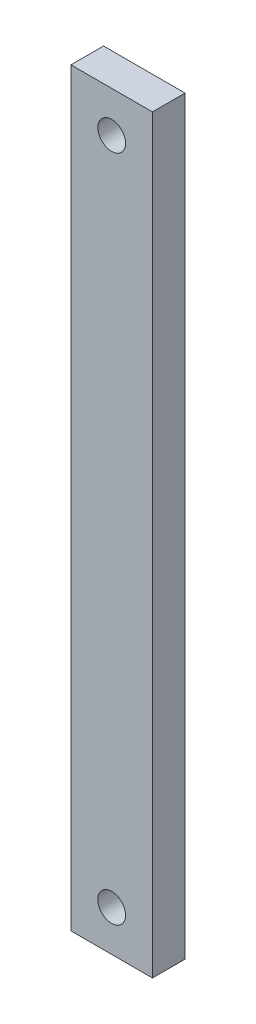
ISO-10303-21;
HEADER;
FILE_DESCRIPTION(('STEP AP214'),'2;1');
FILE_NAME('part.step','',(''),(''),'','','');
FILE_SCHEMA(('AUTOMOTIVE_DESIGN { 1 0 10303 214 1 1 1 1 }'));
ENDSEC;
DATA;
#1=APPLICATION_CONTEXT('core data for automotive mechanical design processes');
#2=APPLICATION_PROTOCOL_DEFINITION('international standard','automotive_design',2000,#1);
#3=PRODUCT_CONTEXT('',#1,'mechanical');
#4=PRODUCT('Part','Part','',(#3));
#5=PRODUCT_RELATED_PRODUCT_CATEGORY('part','',(#4));
#6=PRODUCT_DEFINITION_FORMATION('','',#4);
#7=PRODUCT_DEFINITION_CONTEXT('part definition',#1,'design');
#8=PRODUCT_DEFINITION('design','',#6,#7);
#9=PRODUCT_DEFINITION_SHAPE('','',#8);
#10=(LENGTH_UNIT() NAMED_UNIT(*) SI_UNIT(.MILLI.,.METRE.));
#11=(NAMED_UNIT(*) PLANE_ANGLE_UNIT() SI_UNIT($,.RADIAN.));
#12=(NAMED_UNIT(*) SI_UNIT($,.STERADIAN.) SOLID_ANGLE_UNIT());
#13=UNCERTAINTY_MEASURE_WITH_UNIT(LENGTH_MEASURE(1.E-05),#10,'distance_accuracy_value','');
#14=(GEOMETRIC_REPRESENTATION_CONTEXT(3) GLOBAL_UNCERTAINTY_ASSIGNED_CONTEXT((#13)) GLOBAL_UNIT_ASSIGNED_CONTEXT((#10,
#11,#12)) REPRESENTATION_CONTEXT('',''));
#15=CARTESIAN_POINT('',(0.,0.,0.));
#16=DIRECTION('',(0.,0.,1.));
#17=DIRECTION('',(1.,0.,0.));
#18=AXIS2_PLACEMENT_3D('',#15,#16,#17);
#19=CARTESIAN_POINT('',(75.,-46.,98.));
#20=DIRECTION('',(1.,0.,0.));
#21=DIRECTION('',(0.,0.,-1.));
#22=AXIS2_PLACEMENT_3D('',#19,#20,#21);
#23=PLANE('',#22);
#24=DIRECTION('',(0.,-1.,0.));
#25=VECTOR('',#24,1.);
#26=CARTESIAN_POINT('',(75.,-46.,94.));
#27=LINE('',#26,#25);
#28=CARTESIAN_POINT('',(75.,46.,94.));
#29=VERTEX_POINT('',#28);
#30=CARTESIAN_POINT('',(75.,-46.,94.));
#31=VERTEX_POINT('',#30);
#32=EDGE_CURVE('E107',#29,#31,#27,.T.);
#33=ORIENTED_EDGE('',*,*,#32,.T.);
#34=DIRECTION('',(0.,0.,-1.));
#35=VECTOR('',#34,1.);
#36=CARTESIAN_POINT('',(75.,-46.,98.));
#37=LINE('',#36,#35);
#38=CARTESIAN_POINT('',(75.,-46.,98.));
#39=VERTEX_POINT('',#38);
#40=EDGE_CURVE('E11',#39,#31,#37,.T.);
#41=ORIENTED_EDGE('',*,*,#40,.F.);
#42=DIRECTION('',(0.,-1.,0.));
#43=VECTOR('',#42,1.);
#44=CARTESIAN_POINT('',(75.,-46.,98.));
#45=LINE('',#44,#43);
#46=CARTESIAN_POINT('',(75.,46.,98.));
#47=VERTEX_POINT('',#46);
#48=EDGE_CURVE('E94',#47,#39,#45,.T.);
#49=ORIENTED_EDGE('',*,*,#48,.F.);
#50=DIRECTION('',(0.,0.,-1.));
#51=VECTOR('',#50,1.);
#52=CARTESIAN_POINT('',(75.,46.,98.));
#53=LINE('',#52,#51);
#54=EDGE_CURVE('E103',#47,#29,#53,.T.);
#55=ORIENTED_EDGE('',*,*,#54,.T.);
#56=EDGE_LOOP('',(#33,#41,#49,#55));
#57=FACE_BOUND('',#56,.T.);
#58=ADVANCED_FACE('F41',(#57),#23,.F.);
#59=CARTESIAN_POINT('',(75.,-46.,98.));
#60=DIRECTION('',(0.,1.,0.));
#61=DIRECTION('',(0.,0.,1.));
#62=AXIS2_PLACEMENT_3D('',#59,#60,#61);
#63=PLANE('',#62);
#64=DIRECTION('',(1.,0.,0.));
#65=VECTOR('',#64,1.);
#66=CARTESIAN_POINT('',(75.,-46.,94.));
#67=LINE('',#66,#65);
#68=CARTESIAN_POINT('',(85.,-46.,94.));
#69=VERTEX_POINT('',#68);
#70=EDGE_CURVE('E98',#31,#69,#67,.T.);
#71=ORIENTED_EDGE('',*,*,#70,.T.);
#72=DIRECTION('',(0.,0.,-1.));
#73=VECTOR('',#72,1.);
#74=CARTESIAN_POINT('',(85.,-46.,98.));
#75=LINE('',#74,#73);
#76=CARTESIAN_POINT('',(85.,-46.,98.));
#77=VERTEX_POINT('',#76);
#78=EDGE_CURVE('E50',#77,#69,#75,.T.);
#79=ORIENTED_EDGE('',*,*,#78,.F.);
#80=DIRECTION('',(1.,0.,0.));
#81=VECTOR('',#80,1.);
#82=CARTESIAN_POINT('',(75.,-46.,98.));
#83=LINE('',#82,#81);
#84=EDGE_CURVE('E89',#39,#77,#83,.T.);
#85=ORIENTED_EDGE('',*,*,#84,.F.);
#86=ORIENTED_EDGE('',*,*,#40,.T.);
#87=EDGE_LOOP('',(#71,#79,#85,#86));
#88=FACE_BOUND('',#87,.T.);
#89=ADVANCED_FACE('F97',(#88),#63,.F.);
#90=CARTESIAN_POINT('',(85.,-46.,98.));
#91=DIRECTION('',(-1.,0.,0.));
#92=DIRECTION('',(0.,0.,1.));
#93=AXIS2_PLACEMENT_3D('',#90,#91,#92);
#94=PLANE('',#93);
#95=DIRECTION('',(0.,1.,0.));
#96=VECTOR('',#95,1.);
#97=CARTESIAN_POINT('',(85.,-46.,94.));
#98=LINE('',#97,#96);
#99=CARTESIAN_POINT('',(85.,46.,94.));
#100=VERTEX_POINT('',#99);
#101=EDGE_CURVE('E76',#69,#100,#98,.T.);
#102=ORIENTED_EDGE('',*,*,#101,.T.);
#103=DIRECTION('',(0.,0.,-1.));
#104=VECTOR('',#103,1.);
#105=CARTESIAN_POINT('',(85.,46.,98.));
#106=LINE('',#105,#104);
#107=CARTESIAN_POINT('',(85.,46.,98.));
#108=VERTEX_POINT('',#107);
#109=EDGE_CURVE('E99',#108,#100,#106,.T.);
#110=ORIENTED_EDGE('',*,*,#109,.F.);
#111=DIRECTION('',(0.,1.,0.));
#112=VECTOR('',#111,1.);
#113=CARTESIAN_POINT('',(85.,-46.,98.));
#114=LINE('',#113,#112);
#115=EDGE_CURVE('E92',#77,#108,#114,.T.);
#116=ORIENTED_EDGE('',*,*,#115,.F.);
#117=ORIENTED_EDGE('',*,*,#78,.T.);
#118=EDGE_LOOP('',(#102,#110,#116,#117));
#119=FACE_BOUND('',#118,.T.);
#120=ADVANCED_FACE('F101',(#119),#94,.F.);
#121=CARTESIAN_POINT('',(75.,46.,98.));
#122=DIRECTION('',(0.,-1.,0.));
#123=DIRECTION('',(0.,0.,-1.));
#124=AXIS2_PLACEMENT_3D('',#121,#122,#123);
#125=PLANE('',#124);
#126=DIRECTION('',(-1.,0.,0.));
#127=VECTOR('',#126,1.);
#128=CARTESIAN_POINT('',(75.,46.,94.));
#129=LINE('',#128,#127);
#130=EDGE_CURVE('E82',#100,#29,#129,.T.);
#131=ORIENTED_EDGE('',*,*,#130,.T.);
#132=ORIENTED_EDGE('',*,*,#54,.F.);
#133=DIRECTION('',(-1.,0.,0.));
#134=VECTOR('',#133,1.);
#135=CARTESIAN_POINT('',(75.,46.,98.));
#136=LINE('',#135,#134);
#137=EDGE_CURVE('E59',#108,#47,#136,.T.);
#138=ORIENTED_EDGE('',*,*,#137,.F.);
#139=ORIENTED_EDGE('',*,*,#109,.T.);
#140=EDGE_LOOP('',(#131,#132,#138,#139));
#141=FACE_BOUND('',#140,.T.);
#142=ADVANCED_FACE('F153',(#141),#125,.F.);
#143=CARTESIAN_POINT('',(0.,0.,98.));
#144=DIRECTION('',(0.,0.,-1.));
#145=DIRECTION('',(-1.,0.,0.));
#146=AXIS2_PLACEMENT_3D('',#143,#144,#145);
#147=PLANE('',#146);
#148=CARTESIAN_POINT('',(80.,-41.,98.));
#149=DIRECTION('',(0.,0.,-1.));
#150=DIRECTION('',(-1.,0.,0.));
#151=AXIS2_PLACEMENT_3D('',#148,#149,#150);
#152=CIRCLE('',#151,1.69999999999999);
#153=CARTESIAN_POINT('',(78.3,-41.,98.));
#154=VERTEX_POINT('',#153);
#155=EDGE_CURVE('E110',#154,#154,#152,.T.);
#156=ORIENTED_EDGE('',*,*,#155,.T.);
#157=EDGE_LOOP('',(#156));
#158=FACE_BOUND('',#157,.T.);
#159=CARTESIAN_POINT('',(80.,41.,98.));
#160=DIRECTION('',(0.,0.,-1.));
#161=DIRECTION('',(-1.,0.,0.));
#162=AXIS2_PLACEMENT_3D('',#159,#160,#161);
#163=CIRCLE('',#162,1.69999999999999);
#164=CARTESIAN_POINT('',(78.3,41.,98.));
#165=VERTEX_POINT('',#164);
#166=EDGE_CURVE('E117',#165,#165,#163,.T.);
#167=ORIENTED_EDGE('',*,*,#166,.T.);
#168=EDGE_LOOP('',(#167));
#169=FACE_BOUND('',#168,.T.);
#170=ORIENTED_EDGE('',*,*,#48,.T.);
#171=ORIENTED_EDGE('',*,*,#84,.T.);
#172=ORIENTED_EDGE('',*,*,#115,.T.);
#173=ORIENTED_EDGE('',*,*,#137,.T.);
#174=EDGE_LOOP('',(#170,#171,#172,#173));
#175=FACE_BOUND('',#174,.T.);
#176=ADVANCED_FACE('F90',(#158,#169,#175),#147,.F.);
#177=CARTESIAN_POINT('',(0.,0.,94.));
#178=DIRECTION('',(0.,0.,-1.));
#179=DIRECTION('',(-1.,0.,0.));
#180=AXIS2_PLACEMENT_3D('',#177,#178,#179);
#181=PLANE('',#180);
#182=CARTESIAN_POINT('',(80.,-41.,94.));
#183=DIRECTION('',(0.,0.,-1.));
#184=DIRECTION('',(-1.,0.,0.));
#185=AXIS2_PLACEMENT_3D('',#182,#183,#184);
#186=CIRCLE('',#185,1.69999999999999);
#187=CARTESIAN_POINT('',(78.3,-41.,94.));
#188=VERTEX_POINT('',#187);
#189=EDGE_CURVE('E44',#188,#188,#186,.T.);
#190=ORIENTED_EDGE('',*,*,#189,.F.);
#191=EDGE_LOOP('',(#190));
#192=FACE_BOUND('',#191,.T.);
#193=CARTESIAN_POINT('',(80.,41.,94.));
#194=DIRECTION('',(0.,0.,-1.));
#195=DIRECTION('',(-1.,0.,0.));
#196=AXIS2_PLACEMENT_3D('',#193,#194,#195);
#197=CIRCLE('',#196,1.69999999999999);
#198=CARTESIAN_POINT('',(78.3,41.,94.));
#199=VERTEX_POINT('',#198);
#200=EDGE_CURVE('E115',#199,#199,#197,.T.);
#201=ORIENTED_EDGE('',*,*,#200,.F.);
#202=EDGE_LOOP('',(#201));
#203=FACE_BOUND('',#202,.T.);
#204=ORIENTED_EDGE('',*,*,#32,.F.);
#205=ORIENTED_EDGE('',*,*,#130,.F.);
#206=ORIENTED_EDGE('',*,*,#101,.F.);
#207=ORIENTED_EDGE('',*,*,#70,.F.);
#208=EDGE_LOOP('',(#204,#205,#206,#207));
#209=FACE_BOUND('',#208,.T.);
#210=ADVANCED_FACE('F138',(#192,#203,#209),#181,.T.);
#211=CARTESIAN_POINT('',(80.,41.,93.));
#212=DIRECTION('',(0.,0.,1.));
#213=DIRECTION('',(1.,0.,0.));
#214=AXIS2_PLACEMENT_3D('',#211,#212,#213);
#215=CYLINDRICAL_SURFACE('',#214,1.69999999999999);
#216=ORIENTED_EDGE('',*,*,#200,.T.);
#217=EDGE_LOOP('',(#216));
#218=FACE_BOUND('',#217,.T.);
#219=ORIENTED_EDGE('',*,*,#166,.F.);
#220=EDGE_LOOP('',(#219));
#221=FACE_BOUND('',#220,.T.);
#222=ADVANCED_FACE('F132',(#218,#221),#215,.F.);
#223=CARTESIAN_POINT('',(80.,-41.,93.));
#224=DIRECTION('',(0.,0.,1.));
#225=DIRECTION('',(1.,0.,0.));
#226=AXIS2_PLACEMENT_3D('',#223,#224,#225);
#227=CYLINDRICAL_SURFACE('',#226,1.69999999999999);
#228=ORIENTED_EDGE('',*,*,#189,.T.);
#229=EDGE_LOOP('',(#228));
#230=FACE_BOUND('',#229,.T.);
#231=ORIENTED_EDGE('',*,*,#155,.F.);
#232=EDGE_LOOP('',(#231));
#233=FACE_BOUND('',#232,.T.);
#234=ADVANCED_FACE('F130',(#230,#233),#227,.F.);
#235=CLOSED_SHELL('',(#58,#89,#120,#142,#176,#210,#222,#234));
#236=MANIFOLD_SOLID_BREP('B2',#235);
#237=ADVANCED_BREP_SHAPE_REPRESENTATION('',(#18,#236),#14);
#238=SHAPE_DEFINITION_REPRESENTATION(#9,#237);
ENDSEC;
END-ISO-10303-21;
